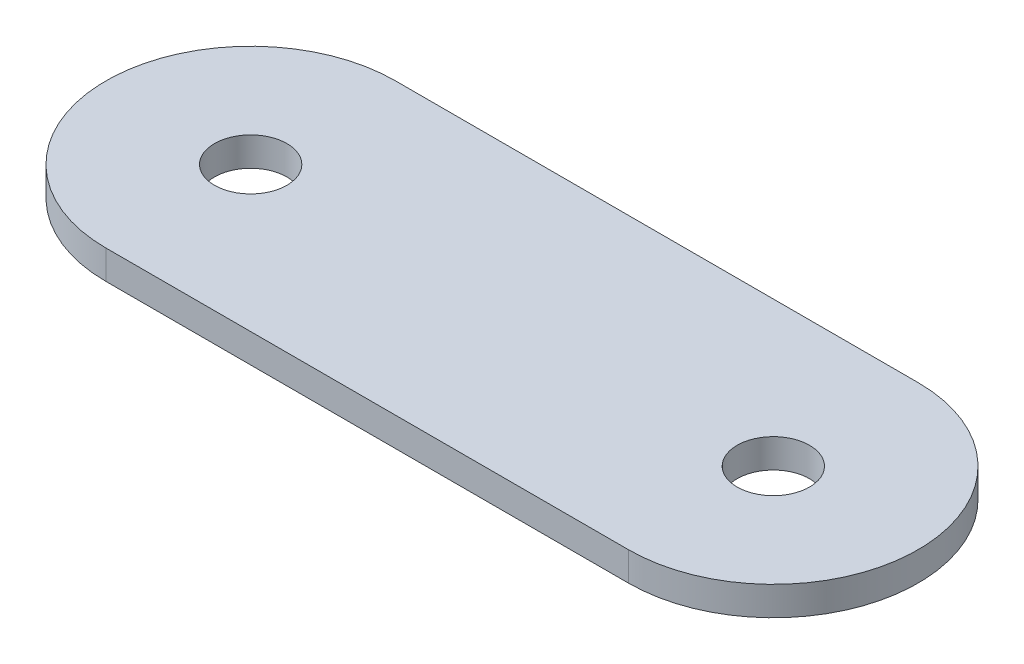
ISO-10303-21;
HEADER;
FILE_DESCRIPTION(('STEP AP214'),'2;1');
FILE_NAME('part.step','',(''),(''),'','','');
FILE_SCHEMA(('AUTOMOTIVE_DESIGN { 1 0 10303 214 1 1 1 1 }'));
ENDSEC;
DATA;
#1=APPLICATION_CONTEXT('core data for automotive mechanical design processes');
#2=APPLICATION_PROTOCOL_DEFINITION('international standard','automotive_design',2000,#1);
#3=PRODUCT_CONTEXT('',#1,'mechanical');
#4=PRODUCT('Part','Part','',(#3));
#5=PRODUCT_RELATED_PRODUCT_CATEGORY('part','',(#4));
#6=PRODUCT_DEFINITION_FORMATION('','',#4);
#7=PRODUCT_DEFINITION_CONTEXT('part definition',#1,'design');
#8=PRODUCT_DEFINITION('design','',#6,#7);
#9=PRODUCT_DEFINITION_SHAPE('','',#8);
#10=(LENGTH_UNIT() NAMED_UNIT(*) SI_UNIT(.MILLI.,.METRE.));
#11=(NAMED_UNIT(*) PLANE_ANGLE_UNIT() SI_UNIT($,.RADIAN.));
#12=(NAMED_UNIT(*) SI_UNIT($,.STERADIAN.) SOLID_ANGLE_UNIT());
#13=UNCERTAINTY_MEASURE_WITH_UNIT(LENGTH_MEASURE(1.E-05),#10,'distance_accuracy_value','');
#14=(GEOMETRIC_REPRESENTATION_CONTEXT(3) GLOBAL_UNCERTAINTY_ASSIGNED_CONTEXT((#13)) GLOBAL_UNIT_ASSIGNED_CONTEXT((#10,
#11,#12)) REPRESENTATION_CONTEXT('',''));
#15=CARTESIAN_POINT('',(0.,0.,0.));
#16=DIRECTION('',(0.,0.,1.));
#17=DIRECTION('',(1.,0.,0.));
#18=AXIS2_PLACEMENT_3D('',#15,#16,#17);
#19=CARTESIAN_POINT('',(-18.05,2.,0.));
#20=DIRECTION('',(0.,1.,0.));
#21=DIRECTION('',(0.,0.,1.));
#22=AXIS2_PLACEMENT_3D('',#19,#20,#21);
#23=PLANE('',#22);
#24=CARTESIAN_POINT('',(-18.05,2.,0.));
#25=DIRECTION('',(0.,1.,0.));
#26=DIRECTION('',(0.,0.,1.));
#27=AXIS2_PLACEMENT_3D('',#24,#25,#26);
#28=CIRCLE('',#27,2.5);
#29=CARTESIAN_POINT('',(-18.05,2.,2.5));
#30=VERTEX_POINT('',#29);
#31=EDGE_CURVE('E103',#30,#30,#28,.T.);
#32=ORIENTED_EDGE('',*,*,#31,.F.);
#33=EDGE_LOOP('',(#32));
#34=FACE_BOUND('',#33,.T.);
#35=CARTESIAN_POINT('',(-18.05,2.,0.));
#36=DIRECTION('',(0.,1.,0.));
#37=DIRECTION('',(0.,0.,1.));
#38=AXIS2_PLACEMENT_3D('',#35,#36,#37);
#39=CIRCLE('',#38,10.);
#40=CARTESIAN_POINT('',(-18.05,2.,-10.));
#41=VERTEX_POINT('',#40);
#42=CARTESIAN_POINT('',(-18.05,2.,10.));
#43=VERTEX_POINT('',#42);
#44=EDGE_CURVE('E88',#41,#43,#39,.T.);
#45=ORIENTED_EDGE('',*,*,#44,.T.);
#46=DIRECTION('',(1.,0.,0.));
#47=VECTOR('',#46,1.);
#48=CARTESIAN_POINT('',(-18.05,2.,10.));
#49=LINE('',#48,#47);
#50=CARTESIAN_POINT('',(18.05,2.,9.99999999999999));
#51=VERTEX_POINT('',#50);
#52=EDGE_CURVE('E83',#43,#51,#49,.T.);
#53=ORIENTED_EDGE('',*,*,#52,.T.);
#54=CARTESIAN_POINT('',(18.05,2.,0.));
#55=DIRECTION('',(0.,1.,0.));
#56=DIRECTION('',(0.,0.,1.));
#57=AXIS2_PLACEMENT_3D('',#54,#55,#56);
#58=CIRCLE('',#57,10.);
#59=CARTESIAN_POINT('',(18.05,2.,-10.));
#60=VERTEX_POINT('',#59);
#61=EDGE_CURVE('E86',#51,#60,#58,.T.);
#62=ORIENTED_EDGE('',*,*,#61,.T.);
#63=DIRECTION('',(-1.,0.,0.));
#64=VECTOR('',#63,1.);
#65=CARTESIAN_POINT('',(-18.05,2.,-10.));
#66=LINE('',#65,#64);
#67=EDGE_CURVE('E53',#60,#41,#66,.T.);
#68=ORIENTED_EDGE('',*,*,#67,.T.);
#69=EDGE_LOOP('',(#45,#53,#62,#68));
#70=FACE_BOUND('',#69,.T.);
#71=CARTESIAN_POINT('',(18.05,2.,0.));
#72=DIRECTION('',(0.,1.,0.));
#73=DIRECTION('',(0.,0.,1.));
#74=AXIS2_PLACEMENT_3D('',#71,#72,#73);
#75=CIRCLE('',#74,2.5);
#76=CARTESIAN_POINT('',(18.05,2.,2.49999999999999));
#77=VERTEX_POINT('',#76);
#78=EDGE_CURVE('E118',#77,#77,#75,.T.);
#79=ORIENTED_EDGE('',*,*,#78,.F.);
#80=EDGE_LOOP('',(#79));
#81=FACE_BOUND('',#80,.T.);
#82=ADVANCED_FACE('F36',(#34,#70,#81),#23,.T.);
#83=CARTESIAN_POINT('',(-18.05,0.,0.));
#84=DIRECTION('',(0.,1.,0.));
#85=DIRECTION('',(0.,0.,1.));
#86=AXIS2_PLACEMENT_3D('',#83,#84,#85);
#87=PLANE('',#86);
#88=CARTESIAN_POINT('',(-18.05,0.,0.));
#89=DIRECTION('',(0.,1.,0.));
#90=DIRECTION('',(0.,0.,1.));
#91=AXIS2_PLACEMENT_3D('',#88,#89,#90);
#92=CIRCLE('',#91,10.);
#93=CARTESIAN_POINT('',(-18.05,0.,-10.));
#94=VERTEX_POINT('',#93);
#95=CARTESIAN_POINT('',(-18.05,0.,10.));
#96=VERTEX_POINT('',#95);
#97=EDGE_CURVE('E100',#94,#96,#92,.T.);
#98=ORIENTED_EDGE('',*,*,#97,.F.);
#99=DIRECTION('',(-1.,0.,0.));
#100=VECTOR('',#99,1.);
#101=CARTESIAN_POINT('',(-18.05,0.,-10.));
#102=LINE('',#101,#100);
#103=CARTESIAN_POINT('',(18.05,0.,-10.));
#104=VERTEX_POINT('',#103);
#105=EDGE_CURVE('E76',#104,#94,#102,.T.);
#106=ORIENTED_EDGE('',*,*,#105,.F.);
#107=CARTESIAN_POINT('',(18.05,0.,0.));
#108=DIRECTION('',(0.,1.,0.));
#109=DIRECTION('',(0.,0.,1.));
#110=AXIS2_PLACEMENT_3D('',#107,#108,#109);
#111=CIRCLE('',#110,10.);
#112=CARTESIAN_POINT('',(18.05,0.,9.99999999999999));
#113=VERTEX_POINT('',#112);
#114=EDGE_CURVE('E70',#113,#104,#111,.T.);
#115=ORIENTED_EDGE('',*,*,#114,.F.);
#116=DIRECTION('',(1.,0.,0.));
#117=VECTOR('',#116,1.);
#118=CARTESIAN_POINT('',(-18.05,0.,10.));
#119=LINE('',#118,#117);
#120=EDGE_CURVE('E92',#96,#113,#119,.T.);
#121=ORIENTED_EDGE('',*,*,#120,.F.);
#122=EDGE_LOOP('',(#98,#106,#115,#121));
#123=FACE_BOUND('',#122,.T.);
#124=CARTESIAN_POINT('',(-18.05,0.,0.));
#125=DIRECTION('',(0.,1.,0.));
#126=DIRECTION('',(0.,0.,1.));
#127=AXIS2_PLACEMENT_3D('',#124,#125,#126);
#128=CIRCLE('',#127,2.5);
#129=CARTESIAN_POINT('',(-18.05,0.,2.5));
#130=VERTEX_POINT('',#129);
#131=EDGE_CURVE('E115',#130,#130,#128,.T.);
#132=ORIENTED_EDGE('',*,*,#131,.T.);
#133=EDGE_LOOP('',(#132));
#134=FACE_BOUND('',#133,.T.);
#135=CARTESIAN_POINT('',(18.05,0.,0.));
#136=DIRECTION('',(0.,1.,0.));
#137=DIRECTION('',(0.,0.,1.));
#138=AXIS2_PLACEMENT_3D('',#135,#136,#137);
#139=CIRCLE('',#138,2.5);
#140=CARTESIAN_POINT('',(18.05,0.,2.49999999999999));
#141=VERTEX_POINT('',#140);
#142=EDGE_CURVE('E121',#141,#141,#139,.T.);
#143=ORIENTED_EDGE('',*,*,#142,.T.);
#144=EDGE_LOOP('',(#143));
#145=FACE_BOUND('',#144,.T.);
#146=ADVANCED_FACE('F111',(#123,#134,#145),#87,.F.);
#147=CARTESIAN_POINT('',(-18.05,2.,0.));
#148=DIRECTION('',(0.,-1.,0.));
#149=DIRECTION('',(0.,0.,-1.));
#150=AXIS2_PLACEMENT_3D('',#147,#148,#149);
#151=CYLINDRICAL_SURFACE('',#150,10.);
#152=ORIENTED_EDGE('',*,*,#97,.T.);
#153=DIRECTION('',(0.,-1.,0.));
#154=VECTOR('',#153,1.);
#155=CARTESIAN_POINT('',(-18.05,2.,10.));
#156=LINE('',#155,#154);
#157=EDGE_CURVE('E11',#43,#96,#156,.T.);
#158=ORIENTED_EDGE('',*,*,#157,.F.);
#159=ORIENTED_EDGE('',*,*,#44,.F.);
#160=DIRECTION('',(0.,-1.,0.));
#161=VECTOR('',#160,1.);
#162=CARTESIAN_POINT('',(-18.05,2.,-10.));
#163=LINE('',#162,#161);
#164=EDGE_CURVE('E96',#41,#94,#163,.T.);
#165=ORIENTED_EDGE('',*,*,#164,.T.);
#166=EDGE_LOOP('',(#152,#158,#159,#165));
#167=FACE_BOUND('',#166,.T.);
#168=ADVANCED_FACE('F38',(#167),#151,.T.);
#169=CARTESIAN_POINT('',(-18.05,2.,10.));
#170=DIRECTION('',(0.,0.,-1.));
#171=DIRECTION('',(-1.,0.,0.));
#172=AXIS2_PLACEMENT_3D('',#169,#170,#171);
#173=PLANE('',#172);
#174=ORIENTED_EDGE('',*,*,#120,.T.);
#175=DIRECTION('',(0.,-1.,0.));
#176=VECTOR('',#175,1.);
#177=CARTESIAN_POINT('',(18.05,2.,9.99999999999999));
#178=LINE('',#177,#176);
#179=EDGE_CURVE('E45',#51,#113,#178,.T.);
#180=ORIENTED_EDGE('',*,*,#179,.F.);
#181=ORIENTED_EDGE('',*,*,#52,.F.);
#182=ORIENTED_EDGE('',*,*,#157,.T.);
#183=EDGE_LOOP('',(#174,#180,#181,#182));
#184=FACE_BOUND('',#183,.T.);
#185=ADVANCED_FACE('F91',(#184),#173,.F.);
#186=CARTESIAN_POINT('',(18.05,2.,0.));
#187=DIRECTION('',(0.,-1.,0.));
#188=DIRECTION('',(0.,0.,-1.));
#189=AXIS2_PLACEMENT_3D('',#186,#187,#188);
#190=CYLINDRICAL_SURFACE('',#189,10.);
#191=ORIENTED_EDGE('',*,*,#114,.T.);
#192=DIRECTION('',(0.,-1.,0.));
#193=VECTOR('',#192,1.);
#194=CARTESIAN_POINT('',(18.05,2.,-10.));
#195=LINE('',#194,#193);
#196=EDGE_CURVE('E93',#60,#104,#195,.T.);
#197=ORIENTED_EDGE('',*,*,#196,.F.);
#198=ORIENTED_EDGE('',*,*,#61,.F.);
#199=ORIENTED_EDGE('',*,*,#179,.T.);
#200=EDGE_LOOP('',(#191,#197,#198,#199));
#201=FACE_BOUND('',#200,.T.);
#202=ADVANCED_FACE('F94',(#201),#190,.T.);
#203=CARTESIAN_POINT('',(-18.05,2.,-10.));
#204=DIRECTION('',(0.,0.,1.));
#205=DIRECTION('',(1.,0.,0.));
#206=AXIS2_PLACEMENT_3D('',#203,#204,#205);
#207=PLANE('',#206);
#208=ORIENTED_EDGE('',*,*,#105,.T.);
#209=ORIENTED_EDGE('',*,*,#164,.F.);
#210=ORIENTED_EDGE('',*,*,#67,.F.);
#211=ORIENTED_EDGE('',*,*,#196,.T.);
#212=EDGE_LOOP('',(#208,#209,#210,#211));
#213=FACE_BOUND('',#212,.T.);
#214=ADVANCED_FACE('F108',(#213),#207,.F.);
#215=CARTESIAN_POINT('',(-18.05,2.,0.));
#216=DIRECTION('',(0.,-1.,0.));
#217=DIRECTION('',(0.,0.,-1.));
#218=AXIS2_PLACEMENT_3D('',#215,#216,#217);
#219=CYLINDRICAL_SURFACE('',#218,2.5);
#220=ORIENTED_EDGE('',*,*,#31,.T.);
#221=EDGE_LOOP('',(#220));
#222=FACE_BOUND('',#221,.T.);
#223=ORIENTED_EDGE('',*,*,#131,.F.);
#224=EDGE_LOOP('',(#223));
#225=FACE_BOUND('',#224,.T.);
#226=ADVANCED_FACE('F138',(#222,#225),#219,.F.);
#227=CARTESIAN_POINT('',(18.05,2.,0.));
#228=DIRECTION('',(0.,-1.,0.));
#229=DIRECTION('',(0.,0.,-1.));
#230=AXIS2_PLACEMENT_3D('',#227,#228,#229);
#231=CYLINDRICAL_SURFACE('',#230,2.5);
#232=ORIENTED_EDGE('',*,*,#78,.T.);
#233=EDGE_LOOP('',(#232));
#234=FACE_BOUND('',#233,.T.);
#235=ORIENTED_EDGE('',*,*,#142,.F.);
#236=EDGE_LOOP('',(#235));
#237=FACE_BOUND('',#236,.T.);
#238=ADVANCED_FACE('F127',(#234,#237),#231,.F.);
#239=CLOSED_SHELL('',(#82,#146,#168,#185,#202,#214,#226,#238));
#240=MANIFOLD_SOLID_BREP('B2',#239);
#241=ADVANCED_BREP_SHAPE_REPRESENTATION('',(#18,#240),#14);
#242=SHAPE_DEFINITION_REPRESENTATION(#9,#241);
ENDSEC;
END-ISO-10303-21;
